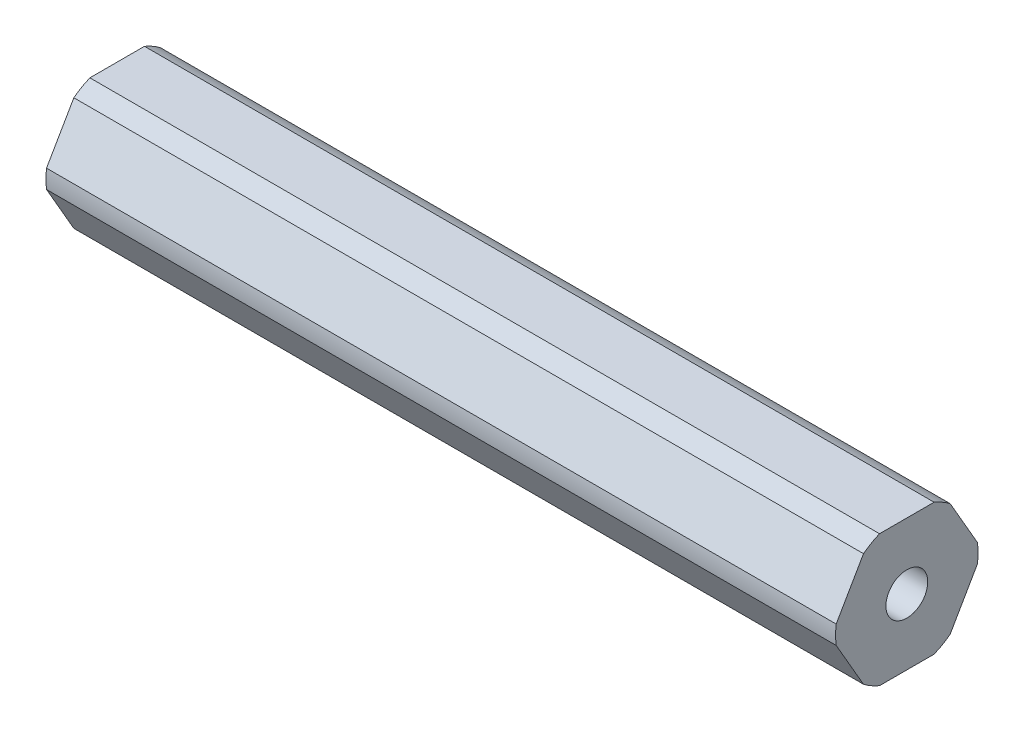
ISO-10303-21;
HEADER;
FILE_DESCRIPTION(('STEP AP214'),'2;1');
FILE_NAME('part.step','',(''),(''),'','','');
FILE_SCHEMA(('AUTOMOTIVE_DESIGN { 1 0 10303 214 1 1 1 1 }'));
ENDSEC;
DATA;
#1=APPLICATION_CONTEXT('core data for automotive mechanical design processes');
#2=APPLICATION_PROTOCOL_DEFINITION('international standard','automotive_design',2000,#1);
#3=PRODUCT_CONTEXT('',#1,'mechanical');
#4=PRODUCT('Part','Part','',(#3));
#5=PRODUCT_RELATED_PRODUCT_CATEGORY('part','',(#4));
#6=PRODUCT_DEFINITION_FORMATION('','',#4);
#7=PRODUCT_DEFINITION_CONTEXT('part definition',#1,'design');
#8=PRODUCT_DEFINITION('design','',#6,#7);
#9=PRODUCT_DEFINITION_SHAPE('','',#8);
#10=(LENGTH_UNIT() NAMED_UNIT(*) SI_UNIT(.MILLI.,.METRE.));
#11=(NAMED_UNIT(*) PLANE_ANGLE_UNIT() SI_UNIT($,.RADIAN.));
#12=(NAMED_UNIT(*) SI_UNIT($,.STERADIAN.) SOLID_ANGLE_UNIT());
#13=UNCERTAINTY_MEASURE_WITH_UNIT(LENGTH_MEASURE(1.E-05),#10,'distance_accuracy_value','');
#14=(GEOMETRIC_REPRESENTATION_CONTEXT(3) GLOBAL_UNCERTAINTY_ASSIGNED_CONTEXT((#13)) GLOBAL_UNIT_ASSIGNED_CONTEXT((#10,
#11,#12)) REPRESENTATION_CONTEXT('',''));
#15=CARTESIAN_POINT('',(0.,0.,0.));
#16=DIRECTION('',(0.,0.,1.));
#17=DIRECTION('',(1.,0.,0.));
#18=AXIS2_PLACEMENT_3D('',#15,#16,#17);
#19=CARTESIAN_POINT('',(38.1,3.17499999999999,-5.49926131403116));
#20=DIRECTION('',(0.,-0.500000000000001,0.866025403784438));
#21=DIRECTION('',(0.,-0.866025403784438,-0.500000000000001));
#22=AXIS2_PLACEMENT_3D('',#19,#20,#21);
#23=PLANE('',#22);
#24=DIRECTION('',(0.,0.866025403784438,0.500000000000001));
#25=VECTOR('',#24,1.);
#26=CARTESIAN_POINT('',(-38.1,3.17499999999999,-5.49926131403116));
#27=LINE('',#26,#25);
#28=CARTESIAN_POINT('',(-38.1,0.89303957103212,-6.81675178197584));
#29=VERTEX_POINT('',#28);
#30=CARTESIAN_POINT('',(-38.1,5.45696042896787,-4.18177084608648));
#31=VERTEX_POINT('',#30);
#32=EDGE_CURVE('E161',#29,#31,#27,.T.);
#33=ORIENTED_EDGE('',*,*,#32,.T.);
#34=DIRECTION('',(-1.,0.,0.));
#35=VECTOR('',#34,1.);
#36=CARTESIAN_POINT('',(38.1,5.45696042896787,-4.18177084608648));
#37=LINE('',#36,#35);
#38=CARTESIAN_POINT('',(38.1,5.45696042896787,-4.18177084608648));
#39=VERTEX_POINT('',#38);
#40=EDGE_CURVE('E11',#39,#31,#37,.T.);
#41=ORIENTED_EDGE('',*,*,#40,.F.);
#42=DIRECTION('',(0.,0.866025403784438,0.500000000000001));
#43=VECTOR('',#42,1.);
#44=CARTESIAN_POINT('',(38.1,3.17499999999999,-5.49926131403116));
#45=LINE('',#44,#43);
#46=CARTESIAN_POINT('',(38.1,0.89303957103212,-6.81675178197584));
#47=VERTEX_POINT('',#46);
#48=EDGE_CURVE('E220',#47,#39,#45,.T.);
#49=ORIENTED_EDGE('',*,*,#48,.F.);
#50=DIRECTION('',(-1.,0.,0.));
#51=VECTOR('',#50,1.);
#52=CARTESIAN_POINT('',(38.1,0.89303957103212,-6.81675178197584));
#53=LINE('',#52,#51);
#54=EDGE_CURVE('E154',#47,#29,#53,.T.);
#55=ORIENTED_EDGE('',*,*,#54,.T.);
#56=EDGE_LOOP('',(#33,#41,#49,#55));
#57=FACE_BOUND('',#56,.T.);
#58=ADVANCED_FACE('F36',(#57),#23,.F.);
#59=CARTESIAN_POINT('',(38.1,0.,0.));
#60=DIRECTION('',(-1.,0.,0.));
#61=DIRECTION('',(0.,0.,1.));
#62=AXIS2_PLACEMENT_3D('',#59,#60,#61);
#63=CYLINDRICAL_SURFACE('',#62,6.874999966);
#64=CARTESIAN_POINT('',(-38.1,0.,0.));
#65=DIRECTION('',(1.,0.,0.));
#66=DIRECTION('',(0.,0.,-1.));
#67=AXIS2_PLACEMENT_3D('',#64,#65,#66);
#68=CIRCLE('',#67,6.874999966);
#69=CARTESIAN_POINT('',(-38.1,6.34999999999998,-2.63498093588933));
#70=VERTEX_POINT('',#69);
#71=EDGE_CURVE('E164',#31,#70,#68,.T.);
#72=ORIENTED_EDGE('',*,*,#71,.T.);
#73=DIRECTION('',(-1.,0.,0.));
#74=VECTOR('',#73,1.);
#75=CARTESIAN_POINT('',(38.1,6.34999999999998,-2.63498093588933));
#76=LINE('',#75,#74);
#77=CARTESIAN_POINT('',(38.1,6.34999999999998,-2.63498093588933));
#78=VERTEX_POINT('',#77);
#79=EDGE_CURVE('E45',#78,#70,#76,.T.);
#80=ORIENTED_EDGE('',*,*,#79,.F.);
#81=CARTESIAN_POINT('',(38.1,0.,0.));
#82=DIRECTION('',(1.,0.,0.));
#83=DIRECTION('',(0.,0.,-1.));
#84=AXIS2_PLACEMENT_3D('',#81,#82,#83);
#85=CIRCLE('',#84,6.874999966);
#86=EDGE_CURVE('E108',#39,#78,#85,.T.);
#87=ORIENTED_EDGE('',*,*,#86,.F.);
#88=ORIENTED_EDGE('',*,*,#40,.T.);
#89=EDGE_LOOP('',(#72,#80,#87,#88));
#90=FACE_BOUND('',#89,.T.);
#91=ADVANCED_FACE('F255',(#90),#63,.T.);
#92=CARTESIAN_POINT('',(38.1,6.34999999999997,0.));
#93=DIRECTION('',(0.,-1.,0.));
#94=DIRECTION('',(0.,0.,-1.));
#95=AXIS2_PLACEMENT_3D('',#92,#93,#94);
#96=PLANE('',#95);
#97=DIRECTION('',(0.,0.,1.));
#98=VECTOR('',#97,1.);
#99=CARTESIAN_POINT('',(-38.1,6.34999999999997,0.));
#100=LINE('',#99,#98);
#101=CARTESIAN_POINT('',(-38.1,6.34999999999997,2.63498093588938));
#102=VERTEX_POINT('',#101);
#103=EDGE_CURVE('E166',#70,#102,#100,.T.);
#104=ORIENTED_EDGE('',*,*,#103,.T.);
#105=DIRECTION('',(-1.,0.,0.));
#106=VECTOR('',#105,1.);
#107=CARTESIAN_POINT('',(38.1,6.34999999999997,2.63498093588938));
#108=LINE('',#107,#106);
#109=CARTESIAN_POINT('',(38.1,6.34999999999997,2.63498093588938));
#110=VERTEX_POINT('',#109);
#111=EDGE_CURVE('E196',#110,#102,#108,.T.);
#112=ORIENTED_EDGE('',*,*,#111,.F.);
#113=DIRECTION('',(0.,0.,1.));
#114=VECTOR('',#113,1.);
#115=CARTESIAN_POINT('',(38.1,6.34999999999997,0.));
#116=LINE('',#115,#114);
#117=EDGE_CURVE('E204',#78,#110,#116,.T.);
#118=ORIENTED_EDGE('',*,*,#117,.F.);
#119=ORIENTED_EDGE('',*,*,#79,.T.);
#120=EDGE_LOOP('',(#104,#112,#118,#119));
#121=FACE_BOUND('',#120,.T.);
#122=ADVANCED_FACE('F202',(#121),#96,.F.);
#123=CARTESIAN_POINT('',(-38.1,5.45696042896784,4.18177084608651));
#124=VERTEX_POINT('',#123);
#125=EDGE_CURVE('E167',#102,#124,#68,.T.);
#126=ORIENTED_EDGE('',*,*,#125,.T.);
#127=DIRECTION('',(-1.,0.,0.));
#128=VECTOR('',#127,1.);
#129=CARTESIAN_POINT('',(38.1,5.45696042896784,4.18177084608651));
#130=LINE('',#129,#128);
#131=CARTESIAN_POINT('',(38.1,5.45696042896784,4.18177084608651));
#132=VERTEX_POINT('',#131);
#133=EDGE_CURVE('E193',#132,#124,#130,.T.);
#134=ORIENTED_EDGE('',*,*,#133,.F.);
#135=EDGE_CURVE('E226',#110,#132,#85,.T.);
#136=ORIENTED_EDGE('',*,*,#135,.F.);
#137=ORIENTED_EDGE('',*,*,#111,.T.);
#138=EDGE_LOOP('',(#126,#134,#136,#137));
#139=FACE_BOUND('',#138,.T.);
#140=ADVANCED_FACE('F237',(#139),#63,.T.);
#141=CARTESIAN_POINT('',(38.1,3.17499999999995,5.49926131403118));
#142=DIRECTION('',(0.,-0.499999999999995,-0.866025403784442));
#143=DIRECTION('',(0.,0.866025403784442,-0.499999999999995));
#144=AXIS2_PLACEMENT_3D('',#141,#142,#143);
#145=PLANE('',#144);
#146=DIRECTION('',(0.,-0.866025403784442,0.499999999999995));
#147=VECTOR('',#146,1.);
#148=CARTESIAN_POINT('',(-38.1,3.17499999999995,5.49926131403118));
#149=LINE('',#148,#147);
#150=CARTESIAN_POINT('',(-38.1,0.893039571032066,6.81675178197585));
#151=VERTEX_POINT('',#150);
#152=EDGE_CURVE('E169',#124,#151,#149,.T.);
#153=ORIENTED_EDGE('',*,*,#152,.T.);
#154=DIRECTION('',(-1.,0.,0.));
#155=VECTOR('',#154,1.);
#156=CARTESIAN_POINT('',(38.1,0.893039571032066,6.81675178197585));
#157=LINE('',#156,#155);
#158=CARTESIAN_POINT('',(38.1,0.893039571032066,6.81675178197585));
#159=VERTEX_POINT('',#158);
#160=EDGE_CURVE('E190',#159,#151,#157,.T.);
#161=ORIENTED_EDGE('',*,*,#160,.F.);
#162=DIRECTION('',(0.,-0.866025403784442,0.499999999999995));
#163=VECTOR('',#162,1.);
#164=CARTESIAN_POINT('',(38.1,3.17499999999995,5.49926131403118));
#165=LINE('',#164,#163);
#166=EDGE_CURVE('E228',#132,#159,#165,.T.);
#167=ORIENTED_EDGE('',*,*,#166,.F.);
#168=ORIENTED_EDGE('',*,*,#133,.T.);
#169=EDGE_LOOP('',(#153,#161,#167,#168));
#170=FACE_BOUND('',#169,.T.);
#171=ADVANCED_FACE('F239',(#170),#145,.F.);
#172=CARTESIAN_POINT('',(-38.1,-0.893039571032163,6.81675178197583));
#173=VERTEX_POINT('',#172);
#174=EDGE_CURVE('E171',#151,#173,#68,.T.);
#175=ORIENTED_EDGE('',*,*,#174,.T.);
#176=DIRECTION('',(-1.,0.,0.));
#177=VECTOR('',#176,1.);
#178=CARTESIAN_POINT('',(38.1,-0.893039571032163,6.81675178197583));
#179=LINE('',#178,#177);
#180=CARTESIAN_POINT('',(38.1,-0.893039571032163,6.81675178197583));
#181=VERTEX_POINT('',#180);
#182=EDGE_CURVE('E187',#181,#173,#179,.T.);
#183=ORIENTED_EDGE('',*,*,#182,.F.);
#184=EDGE_CURVE('E229',#159,#181,#85,.T.);
#185=ORIENTED_EDGE('',*,*,#184,.F.);
#186=ORIENTED_EDGE('',*,*,#160,.T.);
#187=EDGE_LOOP('',(#175,#183,#185,#186));
#188=FACE_BOUND('',#187,.T.);
#189=ADVANCED_FACE('F240',(#188),#63,.T.);
#190=CARTESIAN_POINT('',(38.1,-3.17500000000003,5.49926131403114));
#191=DIRECTION('',(0.,0.500000000000007,-0.866025403784435));
#192=DIRECTION('',(0.,0.866025403784435,0.500000000000007));
#193=AXIS2_PLACEMENT_3D('',#190,#191,#192);
#194=PLANE('',#193);
#195=DIRECTION('',(0.,-0.866025403784435,-0.500000000000007));
#196=VECTOR('',#195,1.);
#197=CARTESIAN_POINT('',(-38.1,-3.17500000000003,5.49926131403114));
#198=LINE('',#197,#196);
#199=CARTESIAN_POINT('',(-38.1,-5.4569604289679,4.18177084608644));
#200=VERTEX_POINT('',#199);
#201=EDGE_CURVE('E172',#173,#200,#198,.T.);
#202=ORIENTED_EDGE('',*,*,#201,.T.);
#203=DIRECTION('',(-1.,0.,0.));
#204=VECTOR('',#203,1.);
#205=CARTESIAN_POINT('',(38.1,-5.4569604289679,4.18177084608644));
#206=LINE('',#205,#204);
#207=CARTESIAN_POINT('',(38.1,-5.4569604289679,4.18177084608644));
#208=VERTEX_POINT('',#207);
#209=EDGE_CURVE('E184',#208,#200,#206,.T.);
#210=ORIENTED_EDGE('',*,*,#209,.F.);
#211=DIRECTION('',(0.,-0.866025403784435,-0.500000000000007));
#212=VECTOR('',#211,1.);
#213=CARTESIAN_POINT('',(38.1,-3.17500000000003,5.49926131403114));
#214=LINE('',#213,#212);
#215=EDGE_CURVE('E230',#181,#208,#214,.T.);
#216=ORIENTED_EDGE('',*,*,#215,.F.);
#217=ORIENTED_EDGE('',*,*,#182,.T.);
#218=EDGE_LOOP('',(#202,#210,#216,#217));
#219=FACE_BOUND('',#218,.T.);
#220=ADVANCED_FACE('F243',(#219),#194,.F.);
#221=CARTESIAN_POINT('',(-38.1,-6.35,2.63498093588929));
#222=VERTEX_POINT('',#221);
#223=EDGE_CURVE('E174',#200,#222,#68,.T.);
#224=ORIENTED_EDGE('',*,*,#223,.T.);
#225=DIRECTION('',(-1.,0.,0.));
#226=VECTOR('',#225,1.);
#227=CARTESIAN_POINT('',(38.1,-6.35,2.63498093588929));
#228=LINE('',#227,#226);
#229=CARTESIAN_POINT('',(38.1,-6.35,2.63498093588929));
#230=VERTEX_POINT('',#229);
#231=EDGE_CURVE('E181',#230,#222,#228,.T.);
#232=ORIENTED_EDGE('',*,*,#231,.F.);
#233=EDGE_CURVE('E144',#208,#230,#85,.T.);
#234=ORIENTED_EDGE('',*,*,#233,.F.);
#235=ORIENTED_EDGE('',*,*,#209,.T.);
#236=EDGE_LOOP('',(#224,#232,#234,#235));
#237=FACE_BOUND('',#236,.T.);
#238=ADVANCED_FACE('F245',(#237),#63,.T.);
#239=CARTESIAN_POINT('',(38.1,-6.34999999999997,0.));
#240=DIRECTION('',(0.,1.,0.));
#241=DIRECTION('',(0.,0.,1.));
#242=AXIS2_PLACEMENT_3D('',#239,#240,#241);
#243=PLANE('',#242);
#244=DIRECTION('',(0.,0.,-1.));
#245=VECTOR('',#244,1.);
#246=CARTESIAN_POINT('',(-38.1,-6.34999999999997,0.));
#247=LINE('',#246,#245);
#248=CARTESIAN_POINT('',(-38.1,-6.34999999999994,-2.63498093588942));
#249=VERTEX_POINT('',#248);
#250=EDGE_CURVE('E175',#222,#249,#247,.T.);
#251=ORIENTED_EDGE('',*,*,#250,.T.);
#252=DIRECTION('',(-1.,0.,0.));
#253=VECTOR('',#252,1.);
#254=CARTESIAN_POINT('',(38.1,-6.34999999999994,-2.63498093588942));
#255=LINE('',#254,#253);
#256=CARTESIAN_POINT('',(38.1,-6.34999999999994,-2.63498093588942));
#257=VERTEX_POINT('',#256);
#258=EDGE_CURVE('E149',#257,#249,#255,.T.);
#259=ORIENTED_EDGE('',*,*,#258,.F.);
#260=DIRECTION('',(0.,0.,-1.));
#261=VECTOR('',#260,1.);
#262=CARTESIAN_POINT('',(38.1,-6.34999999999997,0.));
#263=LINE('',#262,#261);
#264=EDGE_CURVE('E139',#230,#257,#263,.T.);
#265=ORIENTED_EDGE('',*,*,#264,.F.);
#266=ORIENTED_EDGE('',*,*,#231,.T.);
#267=EDGE_LOOP('',(#251,#259,#265,#266));
#268=FACE_BOUND('',#267,.T.);
#269=ADVANCED_FACE('F248',(#268),#243,.F.);
#270=CARTESIAN_POINT('',(-38.1,-5.4569604289678,-4.18177084608657));
#271=VERTEX_POINT('',#270);
#272=EDGE_CURVE('E148',#249,#271,#68,.T.);
#273=ORIENTED_EDGE('',*,*,#272,.T.);
#274=DIRECTION('',(-1.,0.,0.));
#275=VECTOR('',#274,1.);
#276=CARTESIAN_POINT('',(38.1,-5.4569604289678,-4.18177084608657));
#277=LINE('',#276,#275);
#278=CARTESIAN_POINT('',(38.1,-5.4569604289678,-4.18177084608657));
#279=VERTEX_POINT('',#278);
#280=EDGE_CURVE('E145',#279,#271,#277,.T.);
#281=ORIENTED_EDGE('',*,*,#280,.F.);
#282=EDGE_CURVE('E133',#257,#279,#85,.T.);
#283=ORIENTED_EDGE('',*,*,#282,.F.);
#284=ORIENTED_EDGE('',*,*,#258,.T.);
#285=EDGE_LOOP('',(#273,#281,#283,#284));
#286=FACE_BOUND('',#285,.T.);
#287=ADVANCED_FACE('F146',(#286),#63,.T.);
#288=CARTESIAN_POINT('',(38.1,-3.17499999999997,-5.4992613140312));
#289=DIRECTION('',(0.,0.499999999999995,0.866025403784441));
#290=DIRECTION('',(0.,-0.866025403784441,0.499999999999995));
#291=AXIS2_PLACEMENT_3D('',#288,#289,#290);
#292=PLANE('',#291);
#293=DIRECTION('',(0.,0.866025403784441,-0.499999999999995));
#294=VECTOR('',#293,1.);
#295=CARTESIAN_POINT('',(-38.1,-3.17499999999997,-5.4992613140312));
#296=LINE('',#295,#294);
#297=CARTESIAN_POINT('',(-38.1,-0.893039571032135,-6.81675178197584));
#298=VERTEX_POINT('',#297);
#299=EDGE_CURVE('E94',#271,#298,#296,.T.);
#300=ORIENTED_EDGE('',*,*,#299,.T.);
#301=DIRECTION('',(-1.,0.,0.));
#302=VECTOR('',#301,1.);
#303=CARTESIAN_POINT('',(38.1,-0.893039571032135,-6.81675178197584));
#304=LINE('',#303,#302);
#305=CARTESIAN_POINT('',(38.1,-0.893039571032135,-6.81675178197584));
#306=VERTEX_POINT('',#305);
#307=EDGE_CURVE('E150',#306,#298,#304,.T.);
#308=ORIENTED_EDGE('',*,*,#307,.F.);
#309=DIRECTION('',(0.,0.866025403784441,-0.499999999999995));
#310=VECTOR('',#309,1.);
#311=CARTESIAN_POINT('',(38.1,-3.17499999999997,-5.4992613140312));
#312=LINE('',#311,#310);
#313=EDGE_CURVE('E137',#279,#306,#312,.T.);
#314=ORIENTED_EDGE('',*,*,#313,.F.);
#315=ORIENTED_EDGE('',*,*,#280,.T.);
#316=EDGE_LOOP('',(#300,#308,#314,#315));
#317=FACE_BOUND('',#316,.T.);
#318=ADVANCED_FACE('F152',(#317),#292,.F.);
#319=CARTESIAN_POINT('',(38.1,0.,0.));
#320=DIRECTION('',(-1.,0.,0.));
#321=DIRECTION('',(0.,0.,1.));
#322=AXIS2_PLACEMENT_3D('',#319,#320,#321);
#323=CYLINDRICAL_SURFACE('',#322,2.0193);
#324=CARTESIAN_POINT('',(38.1,0.,0.));
#325=DIRECTION('',(1.,0.,0.));
#326=DIRECTION('',(0.,0.,-1.));
#327=AXIS2_PLACEMENT_3D('',#324,#325,#326);
#328=CIRCLE('',#327,2.0193);
#329=CARTESIAN_POINT('',(38.1,0.,-2.0193));
#330=VERTEX_POINT('',#329);
#331=EDGE_CURVE('E218',#330,#330,#328,.T.);
#332=ORIENTED_EDGE('',*,*,#331,.T.);
#333=EDGE_LOOP('',(#332));
#334=FACE_BOUND('',#333,.T.);
#335=CARTESIAN_POINT('',(-38.1,0.,0.));
#336=DIRECTION('',(1.,0.,0.));
#337=DIRECTION('',(0.,0.,-1.));
#338=AXIS2_PLACEMENT_3D('',#335,#336,#337);
#339=CIRCLE('',#338,2.0193);
#340=CARTESIAN_POINT('',(-38.1,0.,-2.0193));
#341=VERTEX_POINT('',#340);
#342=EDGE_CURVE('E158',#341,#341,#339,.T.);
#343=ORIENTED_EDGE('',*,*,#342,.F.);
#344=EDGE_LOOP('',(#343));
#345=FACE_BOUND('',#344,.T.);
#346=ADVANCED_FACE('F38',(#334,#345),#323,.F.);
#347=EDGE_CURVE('E100',#298,#29,#68,.T.);
#348=ORIENTED_EDGE('',*,*,#347,.T.);
#349=ORIENTED_EDGE('',*,*,#54,.F.);
#350=EDGE_CURVE('E53',#306,#47,#85,.T.);
#351=ORIENTED_EDGE('',*,*,#350,.F.);
#352=ORIENTED_EDGE('',*,*,#307,.T.);
#353=EDGE_LOOP('',(#348,#349,#351,#352));
#354=FACE_BOUND('',#353,.T.);
#355=ADVANCED_FACE('F252',(#354),#63,.T.);
#356=CARTESIAN_POINT('',(38.1,0.,0.));
#357=DIRECTION('',(1.,0.,0.));
#358=DIRECTION('',(0.,0.,-1.));
#359=AXIS2_PLACEMENT_3D('',#356,#357,#358);
#360=PLANE('',#359);
#361=ORIENTED_EDGE('',*,*,#331,.F.);
#362=EDGE_LOOP('',(#361));
#363=FACE_BOUND('',#362,.T.);
#364=ORIENTED_EDGE('',*,*,#48,.T.);
#365=ORIENTED_EDGE('',*,*,#86,.T.);
#366=ORIENTED_EDGE('',*,*,#117,.T.);
#367=ORIENTED_EDGE('',*,*,#135,.T.);
#368=ORIENTED_EDGE('',*,*,#166,.T.);
#369=ORIENTED_EDGE('',*,*,#184,.T.);
#370=ORIENTED_EDGE('',*,*,#215,.T.);
#371=ORIENTED_EDGE('',*,*,#233,.T.);
#372=ORIENTED_EDGE('',*,*,#264,.T.);
#373=ORIENTED_EDGE('',*,*,#282,.T.);
#374=ORIENTED_EDGE('',*,*,#313,.T.);
#375=ORIENTED_EDGE('',*,*,#350,.T.);
#376=EDGE_LOOP('',(#364,#365,#366,#367,#368,#369,#370,#371,#372,#373,#374,#375));
#377=FACE_BOUND('',#376,.T.);
#378=ADVANCED_FACE('F135',(#363,#377),#360,.T.);
#379=CARTESIAN_POINT('',(-38.1,0.,0.));
#380=DIRECTION('',(1.,0.,0.));
#381=DIRECTION('',(0.,0.,-1.));
#382=AXIS2_PLACEMENT_3D('',#379,#380,#381);
#383=PLANE('',#382);
#384=ORIENTED_EDGE('',*,*,#342,.T.);
#385=EDGE_LOOP('',(#384));
#386=FACE_BOUND('',#385,.T.);
#387=ORIENTED_EDGE('',*,*,#32,.F.);
#388=ORIENTED_EDGE('',*,*,#347,.F.);
#389=ORIENTED_EDGE('',*,*,#299,.F.);
#390=ORIENTED_EDGE('',*,*,#272,.F.);
#391=ORIENTED_EDGE('',*,*,#250,.F.);
#392=ORIENTED_EDGE('',*,*,#223,.F.);
#393=ORIENTED_EDGE('',*,*,#201,.F.);
#394=ORIENTED_EDGE('',*,*,#174,.F.);
#395=ORIENTED_EDGE('',*,*,#152,.F.);
#396=ORIENTED_EDGE('',*,*,#125,.F.);
#397=ORIENTED_EDGE('',*,*,#103,.F.);
#398=ORIENTED_EDGE('',*,*,#71,.F.);
#399=EDGE_LOOP('',(#387,#388,#389,#390,#391,#392,#393,#394,#395,#396,#397,#398));
#400=FACE_BOUND('',#399,.T.);
#401=ADVANCED_FACE('F208',(#386,#400),#383,.F.);
#402=CLOSED_SHELL('',(#58,#91,#122,#140,#171,#189,#220,#238,#269,#287,#318,#346,#355,#378,#401));
#403=MANIFOLD_SOLID_BREP('B2',#402);
#404=ADVANCED_BREP_SHAPE_REPRESENTATION('',(#18,#403),#14);
#405=SHAPE_DEFINITION_REPRESENTATION(#9,#404);
ENDSEC;
END-ISO-10303-21;
